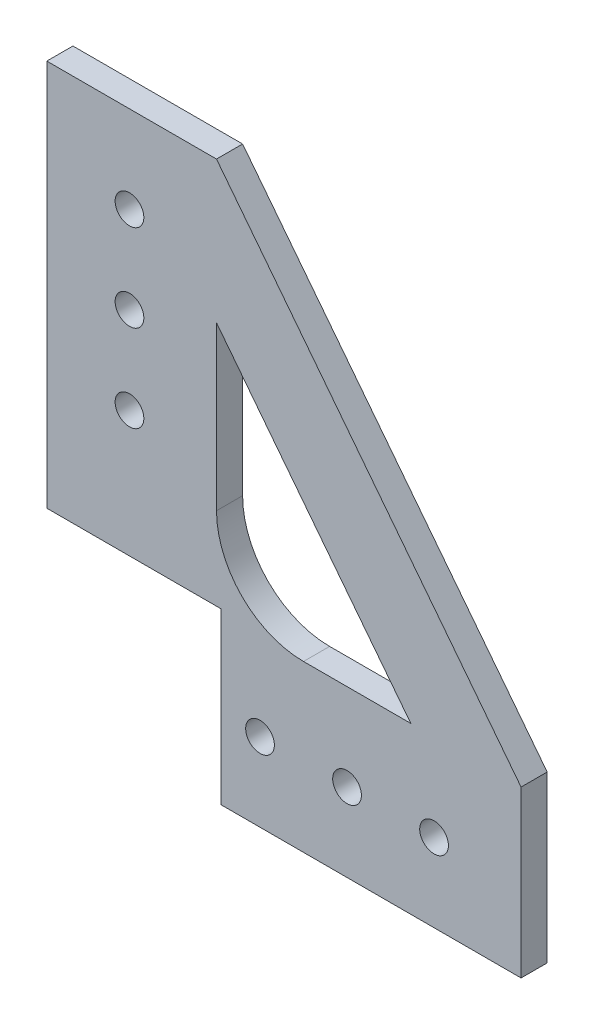
ISO-10303-21;
HEADER;
FILE_DESCRIPTION(('STEP AP214'),'2;1');
FILE_NAME('part.step','',(''),(''),'','','');
FILE_SCHEMA(('AUTOMOTIVE_DESIGN { 1 0 10303 214 1 1 1 1 }'));
ENDSEC;
DATA;
#1=APPLICATION_CONTEXT('core data for automotive mechanical design processes');
#2=APPLICATION_PROTOCOL_DEFINITION('international standard','automotive_design',2000,#1);
#3=PRODUCT_CONTEXT('',#1,'mechanical');
#4=PRODUCT('Part','Part','',(#3));
#5=PRODUCT_RELATED_PRODUCT_CATEGORY('part','',(#4));
#6=PRODUCT_DEFINITION_FORMATION('','',#4);
#7=PRODUCT_DEFINITION_CONTEXT('part definition',#1,'design');
#8=PRODUCT_DEFINITION('design','',#6,#7);
#9=PRODUCT_DEFINITION_SHAPE('','',#8);
#10=(LENGTH_UNIT() NAMED_UNIT(*) SI_UNIT(.MILLI.,.METRE.));
#11=(NAMED_UNIT(*) PLANE_ANGLE_UNIT() SI_UNIT($,.RADIAN.));
#12=(NAMED_UNIT(*) SI_UNIT($,.STERADIAN.) SOLID_ANGLE_UNIT());
#13=UNCERTAINTY_MEASURE_WITH_UNIT(LENGTH_MEASURE(1.E-05),#10,'distance_accuracy_value','');
#14=(GEOMETRIC_REPRESENTATION_CONTEXT(3) GLOBAL_UNCERTAINTY_ASSIGNED_CONTEXT((#13)) GLOBAL_UNIT_ASSIGNED_CONTEXT((#10,
#11,#12)) REPRESENTATION_CONTEXT('',''));
#15=CARTESIAN_POINT('',(0.,0.,0.));
#16=DIRECTION('',(0.,0.,1.));
#17=DIRECTION('',(1.,0.,0.));
#18=AXIS2_PLACEMENT_3D('',#15,#16,#17);
#19=CARTESIAN_POINT('',(0.,0.,3.));
#20=DIRECTION('',(0.,0.,-1.));
#21=DIRECTION('',(-1.,0.,0.));
#22=AXIS2_PLACEMENT_3D('',#19,#20,#21);
#23=PLANE('',#22);
#24=CARTESIAN_POINT('',(45.,-10.,3.));
#25=DIRECTION('',(0.,0.,1.));
#26=DIRECTION('',(1.,0.,0.));
#27=AXIS2_PLACEMENT_3D('',#24,#25,#26);
#28=CIRCLE('',#27,1.65);
#29=CARTESIAN_POINT('',(46.65,-10.,3.));
#30=VERTEX_POINT('',#29);
#31=EDGE_CURVE('E188',#30,#30,#28,.T.);
#32=ORIENTED_EDGE('',*,*,#31,.F.);
#33=EDGE_LOOP('',(#32));
#34=FACE_BOUND('',#33,.T.);
#35=CARTESIAN_POINT('',(35.,-10.,3.));
#36=DIRECTION('',(0.,0.,1.));
#37=DIRECTION('',(1.,0.,0.));
#38=AXIS2_PLACEMENT_3D('',#35,#36,#37);
#39=CIRCLE('',#38,1.65);
#40=CARTESIAN_POINT('',(36.65,-10.,3.));
#41=VERTEX_POINT('',#40);
#42=EDGE_CURVE('E194',#41,#41,#39,.T.);
#43=ORIENTED_EDGE('',*,*,#42,.F.);
#44=EDGE_LOOP('',(#43));
#45=FACE_BOUND('',#44,.T.);
#46=CARTESIAN_POINT('',(25.,-10.,3.));
#47=DIRECTION('',(0.,0.,1.));
#48=DIRECTION('',(1.,0.,0.));
#49=AXIS2_PLACEMENT_3D('',#46,#47,#48);
#50=CIRCLE('',#49,1.65);
#51=CARTESIAN_POINT('',(26.65,-10.,3.));
#52=VERTEX_POINT('',#51);
#53=EDGE_CURVE('E200',#52,#52,#50,.T.);
#54=ORIENTED_EDGE('',*,*,#53,.F.);
#55=EDGE_LOOP('',(#54));
#56=FACE_BOUND('',#55,.T.);
#57=CARTESIAN_POINT('',(10.,35.,3.));
#58=DIRECTION('',(0.,0.,1.));
#59=DIRECTION('',(1.,0.,0.));
#60=AXIS2_PLACEMENT_3D('',#57,#58,#59);
#61=CIRCLE('',#60,1.65000000000001);
#62=CARTESIAN_POINT('',(11.65,35.,3.));
#63=VERTEX_POINT('',#62);
#64=EDGE_CURVE('E206',#63,#63,#61,.T.);
#65=ORIENTED_EDGE('',*,*,#64,.F.);
#66=EDGE_LOOP('',(#65));
#67=FACE_BOUND('',#66,.T.);
#68=CARTESIAN_POINT('',(10.,25.,3.));
#69=DIRECTION('',(0.,0.,1.));
#70=DIRECTION('',(1.,0.,0.));
#71=AXIS2_PLACEMENT_3D('',#68,#69,#70);
#72=CIRCLE('',#71,1.65);
#73=CARTESIAN_POINT('',(11.65,25.,3.));
#74=VERTEX_POINT('',#73);
#75=EDGE_CURVE('E212',#74,#74,#72,.T.);
#76=ORIENTED_EDGE('',*,*,#75,.F.);
#77=EDGE_LOOP('',(#76));
#78=FACE_BOUND('',#77,.T.);
#79=CARTESIAN_POINT('',(10.,15.,3.));
#80=DIRECTION('',(0.,0.,1.));
#81=DIRECTION('',(1.,0.,0.));
#82=AXIS2_PLACEMENT_3D('',#79,#80,#81);
#83=CIRCLE('',#82,1.65);
#84=CARTESIAN_POINT('',(11.65,15.,3.));
#85=VERTEX_POINT('',#84);
#86=EDGE_CURVE('E218',#85,#85,#83,.T.);
#87=ORIENTED_EDGE('',*,*,#86,.F.);
#88=EDGE_LOOP('',(#87));
#89=FACE_BOUND('',#88,.T.);
#90=DIRECTION('',(-1.,0.,0.));
#91=VECTOR('',#90,1.);
#92=CARTESIAN_POINT('',(0.,45.,3.));
#93=LINE('',#92,#91);
#94=CARTESIAN_POINT('',(20.,45.,3.));
#95=VERTEX_POINT('',#94);
#96=CARTESIAN_POINT('',(0.5,45.,3.));
#97=VERTEX_POINT('',#96);
#98=EDGE_CURVE('E229',#95,#97,#93,.T.);
#99=ORIENTED_EDGE('',*,*,#98,.T.);
#100=DIRECTION('',(0.,1.,0.));
#101=VECTOR('',#100,1.);
#102=CARTESIAN_POINT('',(0.5,0.5,3.));
#103=LINE('',#102,#101);
#104=CARTESIAN_POINT('',(0.5,0.5,3.));
#105=VERTEX_POINT('',#104);
#106=EDGE_CURVE('E56',#105,#97,#103,.T.);
#107=ORIENTED_EDGE('',*,*,#106,.F.);
#108=DIRECTION('',(-1.,0.,0.));
#109=VECTOR('',#108,1.);
#110=CARTESIAN_POINT('',(0.5,0.5,3.));
#111=LINE('',#110,#109);
#112=CARTESIAN_POINT('',(20.5,0.5,3.));
#113=VERTEX_POINT('',#112);
#114=EDGE_CURVE('E134',#113,#105,#111,.T.);
#115=ORIENTED_EDGE('',*,*,#114,.F.);
#116=DIRECTION('',(0.,1.,0.));
#117=VECTOR('',#116,1.);
#118=CARTESIAN_POINT('',(20.5,0.5,3.));
#119=LINE('',#118,#117);
#120=CARTESIAN_POINT('',(20.5,-19.,3.));
#121=VERTEX_POINT('',#120);
#122=EDGE_CURVE('E128',#121,#113,#119,.T.);
#123=ORIENTED_EDGE('',*,*,#122,.F.);
#124=DIRECTION('',(-1.,0.,0.));
#125=VECTOR('',#124,1.);
#126=CARTESIAN_POINT('',(20.5,-19.,3.));
#127=LINE('',#126,#125);
#128=CARTESIAN_POINT('',(55.,-19.,3.));
#129=VERTEX_POINT('',#128);
#130=EDGE_CURVE('E137',#129,#121,#127,.T.);
#131=ORIENTED_EDGE('',*,*,#130,.F.);
#132=DIRECTION('',(0.,1.,0.));
#133=VECTOR('',#132,1.);
#134=CARTESIAN_POINT('',(55.,0.,3.));
#135=LINE('',#134,#133);
#136=CARTESIAN_POINT('',(55.,0.,3.));
#137=VERTEX_POINT('',#136);
#138=EDGE_CURVE('E224',#129,#137,#135,.T.);
#139=ORIENTED_EDGE('',*,*,#138,.T.);
#140=DIRECTION('',(-0.61394061351492,0.789352217376326,0.));
#141=VECTOR('',#140,1.);
#142=CARTESIAN_POINT('',(20.,45.,3.));
#143=LINE('',#142,#141);
#144=EDGE_CURVE('E226',#137,#95,#143,.T.);
#145=ORIENTED_EDGE('',*,*,#144,.T.);
#146=EDGE_LOOP('',(#99,#107,#115,#123,#131,#139,#145));
#147=FACE_BOUND('',#146,.T.);
#148=DIRECTION('',(-0.61394061351492,0.789352217376326,0.));
#149=VECTOR('',#148,1.);
#150=CARTESIAN_POINT('',(20.,28.7117796414409,3.));
#151=LINE('',#150,#149);
#152=CARTESIAN_POINT('',(42.3313841655651,0.,3.));
#153=VERTEX_POINT('',#152);
#154=CARTESIAN_POINT('',(20.,28.7117796414409,3.));
#155=VERTEX_POINT('',#154);
#156=EDGE_CURVE('E159',#153,#155,#151,.T.);
#157=ORIENTED_EDGE('',*,*,#156,.F.);
#158=DIRECTION('',(1.,0.,0.));
#159=VECTOR('',#158,1.);
#160=CARTESIAN_POINT('',(30.0000000000001,0.,3.));
#161=LINE('',#160,#159);
#162=CARTESIAN_POINT('',(30.0000000000001,0.,3.));
#163=VERTEX_POINT('',#162);
#164=EDGE_CURVE('E166',#163,#153,#161,.T.);
#165=ORIENTED_EDGE('',*,*,#164,.F.);
#166=CARTESIAN_POINT('',(30.,10.,3.));
#167=DIRECTION('',(0.,0.,1.));
#168=DIRECTION('',(-1.,0.,0.));
#169=AXIS2_PLACEMENT_3D('',#166,#167,#168);
#170=CIRCLE('',#169,10.);
#171=CARTESIAN_POINT('',(20.,10.0000000000001,3.));
#172=VERTEX_POINT('',#171);
#173=EDGE_CURVE('E164',#172,#163,#170,.T.);
#174=ORIENTED_EDGE('',*,*,#173,.F.);
#175=DIRECTION('',(0.,-1.,0.));
#176=VECTOR('',#175,1.);
#177=CARTESIAN_POINT('',(20.,10.0000000000001,3.));
#178=LINE('',#177,#176);
#179=EDGE_CURVE('E161',#155,#172,#178,.T.);
#180=ORIENTED_EDGE('',*,*,#179,.F.);
#181=EDGE_LOOP('',(#157,#165,#174,#180));
#182=FACE_BOUND('',#181,.T.);
#183=ADVANCED_FACE('F41',(#34,#45,#56,#67,#78,#89,#147,#182),#23,.F.);
#184=CARTESIAN_POINT('',(0.,0.,0.));
#185=DIRECTION('',(0.,0.,-1.));
#186=DIRECTION('',(-1.,0.,0.));
#187=AXIS2_PLACEMENT_3D('',#184,#185,#186);
#188=PLANE('',#187);
#189=DIRECTION('',(0.,-1.,0.));
#190=VECTOR('',#189,1.);
#191=CARTESIAN_POINT('',(0.5,0.,0.));
#192=LINE('',#191,#190);
#193=CARTESIAN_POINT('',(0.5,45.,0.));
#194=VERTEX_POINT('',#193);
#195=CARTESIAN_POINT('',(0.5,0.5,0.));
#196=VERTEX_POINT('',#195);
#197=EDGE_CURVE('E153',#194,#196,#192,.T.);
#198=ORIENTED_EDGE('',*,*,#197,.F.);
#199=DIRECTION('',(-1.,0.,0.));
#200=VECTOR('',#199,1.);
#201=CARTESIAN_POINT('',(0.,45.,0.));
#202=LINE('',#201,#200);
#203=CARTESIAN_POINT('',(20.,45.,0.));
#204=VERTEX_POINT('',#203);
#205=EDGE_CURVE('E227',#204,#194,#202,.T.);
#206=ORIENTED_EDGE('',*,*,#205,.F.);
#207=DIRECTION('',(-0.61394061351492,0.789352217376326,0.));
#208=VECTOR('',#207,1.);
#209=CARTESIAN_POINT('',(20.,45.,0.));
#210=LINE('',#209,#208);
#211=CARTESIAN_POINT('',(55.,0.,0.));
#212=VERTEX_POINT('',#211);
#213=EDGE_CURVE('E233',#212,#204,#210,.T.);
#214=ORIENTED_EDGE('',*,*,#213,.F.);
#215=DIRECTION('',(0.,1.,0.));
#216=VECTOR('',#215,1.);
#217=CARTESIAN_POINT('',(55.,0.,0.));
#218=LINE('',#217,#216);
#219=CARTESIAN_POINT('',(55.,-19.,0.));
#220=VERTEX_POINT('',#219);
#221=EDGE_CURVE('E221',#220,#212,#218,.T.);
#222=ORIENTED_EDGE('',*,*,#221,.F.);
#223=DIRECTION('',(1.,0.,0.));
#224=VECTOR('',#223,1.);
#225=CARTESIAN_POINT('',(0.,-19.,0.));
#226=LINE('',#225,#224);
#227=CARTESIAN_POINT('',(20.5,-19.,0.));
#228=VERTEX_POINT('',#227);
#229=EDGE_CURVE('E156',#228,#220,#226,.T.);
#230=ORIENTED_EDGE('',*,*,#229,.F.);
#231=DIRECTION('',(0.,-1.,0.));
#232=VECTOR('',#231,1.);
#233=CARTESIAN_POINT('',(20.5,0.,0.));
#234=LINE('',#233,#232);
#235=CARTESIAN_POINT('',(20.5,0.5,0.));
#236=VERTEX_POINT('',#235);
#237=EDGE_CURVE('E49',#236,#228,#234,.T.);
#238=ORIENTED_EDGE('',*,*,#237,.F.);
#239=DIRECTION('',(1.,0.,0.));
#240=VECTOR('',#239,1.);
#241=CARTESIAN_POINT('',(0.,0.5,0.));
#242=LINE('',#241,#240);
#243=EDGE_CURVE('E11',#196,#236,#242,.T.);
#244=ORIENTED_EDGE('',*,*,#243,.F.);
#245=EDGE_LOOP('',(#198,#206,#214,#222,#230,#238,#244));
#246=FACE_BOUND('',#245,.T.);
#247=CARTESIAN_POINT('',(35.,-10.,0.));
#248=DIRECTION('',(0.,0.,1.));
#249=DIRECTION('',(1.,0.,0.));
#250=AXIS2_PLACEMENT_3D('',#247,#248,#249);
#251=CIRCLE('',#250,1.65);
#252=CARTESIAN_POINT('',(36.65,-10.,0.));
#253=VERTEX_POINT('',#252);
#254=EDGE_CURVE('E191',#253,#253,#251,.T.);
#255=ORIENTED_EDGE('',*,*,#254,.T.);
#256=EDGE_LOOP('',(#255));
#257=FACE_BOUND('',#256,.T.);
#258=CARTESIAN_POINT('',(10.,35.,0.));
#259=DIRECTION('',(0.,0.,1.));
#260=DIRECTION('',(1.,0.,0.));
#261=AXIS2_PLACEMENT_3D('',#258,#259,#260);
#262=CIRCLE('',#261,1.65000000000001);
#263=CARTESIAN_POINT('',(11.65,35.,0.));
#264=VERTEX_POINT('',#263);
#265=EDGE_CURVE('E203',#264,#264,#262,.T.);
#266=ORIENTED_EDGE('',*,*,#265,.T.);
#267=EDGE_LOOP('',(#266));
#268=FACE_BOUND('',#267,.T.);
#269=CARTESIAN_POINT('',(10.,15.,0.));
#270=DIRECTION('',(0.,0.,1.));
#271=DIRECTION('',(1.,0.,0.));
#272=AXIS2_PLACEMENT_3D('',#269,#270,#271);
#273=CIRCLE('',#272,1.65);
#274=CARTESIAN_POINT('',(11.65,15.,0.));
#275=VERTEX_POINT('',#274);
#276=EDGE_CURVE('E215',#275,#275,#273,.T.);
#277=ORIENTED_EDGE('',*,*,#276,.T.);
#278=EDGE_LOOP('',(#277));
#279=FACE_BOUND('',#278,.T.);
#280=CARTESIAN_POINT('',(10.,25.,0.));
#281=DIRECTION('',(0.,0.,1.));
#282=DIRECTION('',(1.,0.,0.));
#283=AXIS2_PLACEMENT_3D('',#280,#281,#282);
#284=CIRCLE('',#283,1.65);
#285=CARTESIAN_POINT('',(11.65,25.,0.));
#286=VERTEX_POINT('',#285);
#287=EDGE_CURVE('E209',#286,#286,#284,.T.);
#288=ORIENTED_EDGE('',*,*,#287,.T.);
#289=EDGE_LOOP('',(#288));
#290=FACE_BOUND('',#289,.T.);
#291=CARTESIAN_POINT('',(25.,-10.,0.));
#292=DIRECTION('',(0.,0.,1.));
#293=DIRECTION('',(1.,0.,0.));
#294=AXIS2_PLACEMENT_3D('',#291,#292,#293);
#295=CIRCLE('',#294,1.65);
#296=CARTESIAN_POINT('',(26.65,-10.,0.));
#297=VERTEX_POINT('',#296);
#298=EDGE_CURVE('E197',#297,#297,#295,.T.);
#299=ORIENTED_EDGE('',*,*,#298,.T.);
#300=EDGE_LOOP('',(#299));
#301=FACE_BOUND('',#300,.T.);
#302=CARTESIAN_POINT('',(45.,-10.,0.));
#303=DIRECTION('',(0.,0.,1.));
#304=DIRECTION('',(1.,0.,0.));
#305=AXIS2_PLACEMENT_3D('',#302,#303,#304);
#306=CIRCLE('',#305,1.65);
#307=CARTESIAN_POINT('',(46.65,-10.,0.));
#308=VERTEX_POINT('',#307);
#309=EDGE_CURVE('E187',#308,#308,#306,.T.);
#310=ORIENTED_EDGE('',*,*,#309,.T.);
#311=EDGE_LOOP('',(#310));
#312=FACE_BOUND('',#311,.T.);
#313=DIRECTION('',(1.,0.,0.));
#314=VECTOR('',#313,1.);
#315=CARTESIAN_POINT('',(30.0000000000001,0.,0.));
#316=LINE('',#315,#314);
#317=CARTESIAN_POINT('',(30.0000000000001,0.,0.));
#318=VERTEX_POINT('',#317);
#319=CARTESIAN_POINT('',(42.3313841655651,0.,0.));
#320=VERTEX_POINT('',#319);
#321=EDGE_CURVE('E162',#318,#320,#316,.T.);
#322=ORIENTED_EDGE('',*,*,#321,.T.);
#323=DIRECTION('',(-0.61394061351492,0.789352217376326,0.));
#324=VECTOR('',#323,1.);
#325=CARTESIAN_POINT('',(20.,28.7117796414409,0.));
#326=LINE('',#325,#324);
#327=CARTESIAN_POINT('',(20.,28.7117796414409,0.));
#328=VERTEX_POINT('',#327);
#329=EDGE_CURVE('E158',#320,#328,#326,.T.);
#330=ORIENTED_EDGE('',*,*,#329,.T.);
#331=DIRECTION('',(0.,-1.,0.));
#332=VECTOR('',#331,1.);
#333=CARTESIAN_POINT('',(20.,10.0000000000001,0.));
#334=LINE('',#333,#332);
#335=CARTESIAN_POINT('',(20.,10.0000000000001,0.));
#336=VERTEX_POINT('',#335);
#337=EDGE_CURVE('E171',#328,#336,#334,.T.);
#338=ORIENTED_EDGE('',*,*,#337,.T.);
#339=CARTESIAN_POINT('',(30.,10.,0.));
#340=DIRECTION('',(0.,0.,1.));
#341=DIRECTION('',(-1.,0.,0.));
#342=AXIS2_PLACEMENT_3D('',#339,#340,#341);
#343=CIRCLE('',#342,10.);
#344=EDGE_CURVE('E174',#336,#318,#343,.T.);
#345=ORIENTED_EDGE('',*,*,#344,.T.);
#346=EDGE_LOOP('',(#322,#330,#338,#345));
#347=FACE_BOUND('',#346,.T.);
#348=ADVANCED_FACE('F250',(#246,#257,#268,#279,#290,#301,#312,#347),#188,.T.);
#349=CARTESIAN_POINT('',(55.,0.,3.));
#350=DIRECTION('',(-1.,0.,0.));
#351=DIRECTION('',(0.,0.,1.));
#352=AXIS2_PLACEMENT_3D('',#349,#350,#351);
#353=PLANE('',#352);
#354=ORIENTED_EDGE('',*,*,#138,.F.);
#355=DIRECTION('',(0.,0.,-1.));
#356=VECTOR('',#355,1.);
#357=CARTESIAN_POINT('',(55.,-19.,3.));
#358=LINE('',#357,#356);
#359=EDGE_CURVE('E140',#129,#220,#358,.T.);
#360=ORIENTED_EDGE('',*,*,#359,.T.);
#361=ORIENTED_EDGE('',*,*,#221,.T.);
#362=DIRECTION('',(0.,0.,-1.));
#363=VECTOR('',#362,1.);
#364=CARTESIAN_POINT('',(55.,0.,3.));
#365=LINE('',#364,#363);
#366=EDGE_CURVE('E239',#137,#212,#365,.T.);
#367=ORIENTED_EDGE('',*,*,#366,.F.);
#368=EDGE_LOOP('',(#354,#360,#361,#367));
#369=FACE_BOUND('',#368,.T.);
#370=ADVANCED_FACE('F43',(#369),#353,.F.);
#371=CARTESIAN_POINT('',(20.,45.,3.));
#372=DIRECTION('',(-0.789352217376326,-0.613940613514921,0.));
#373=DIRECTION('',(0.613940613514921,-0.789352217376326,0.));
#374=AXIS2_PLACEMENT_3D('',#371,#372,#373);
#375=PLANE('',#374);
#376=ORIENTED_EDGE('',*,*,#213,.T.);
#377=DIRECTION('',(0.,0.,-1.));
#378=VECTOR('',#377,1.);
#379=CARTESIAN_POINT('',(20.,45.,3.));
#380=LINE('',#379,#378);
#381=EDGE_CURVE('E231',#95,#204,#380,.T.);
#382=ORIENTED_EDGE('',*,*,#381,.F.);
#383=ORIENTED_EDGE('',*,*,#144,.F.);
#384=ORIENTED_EDGE('',*,*,#366,.T.);
#385=EDGE_LOOP('',(#376,#382,#383,#384));
#386=FACE_BOUND('',#385,.T.);
#387=ADVANCED_FACE('F255',(#386),#375,.F.);
#388=CARTESIAN_POINT('',(0.,45.,3.));
#389=DIRECTION('',(0.,-1.,0.));
#390=DIRECTION('',(0.,0.,-1.));
#391=AXIS2_PLACEMENT_3D('',#388,#389,#390);
#392=PLANE('',#391);
#393=ORIENTED_EDGE('',*,*,#205,.T.);
#394=DIRECTION('',(0.,0.,1.));
#395=VECTOR('',#394,1.);
#396=CARTESIAN_POINT('',(0.5,45.,3.));
#397=LINE('',#396,#395);
#398=EDGE_CURVE('E242',#194,#97,#397,.T.);
#399=ORIENTED_EDGE('',*,*,#398,.T.);
#400=ORIENTED_EDGE('',*,*,#98,.F.);
#401=ORIENTED_EDGE('',*,*,#381,.T.);
#402=EDGE_LOOP('',(#393,#399,#400,#401));
#403=FACE_BOUND('',#402,.T.);
#404=ADVANCED_FACE('F259',(#403),#392,.F.);
#405=CARTESIAN_POINT('',(10.,15.,3.));
#406=DIRECTION('',(0.,0.,-1.));
#407=DIRECTION('',(-1.,0.,0.));
#408=AXIS2_PLACEMENT_3D('',#405,#406,#407);
#409=CYLINDRICAL_SURFACE('',#408,1.65);
#410=ORIENTED_EDGE('',*,*,#86,.T.);
#411=EDGE_LOOP('',(#410));
#412=FACE_BOUND('',#411,.T.);
#413=ORIENTED_EDGE('',*,*,#276,.F.);
#414=EDGE_LOOP('',(#413));
#415=FACE_BOUND('',#414,.T.);
#416=ADVANCED_FACE('F285',(#412,#415),#409,.F.);
#417=CARTESIAN_POINT('',(10.,25.,3.));
#418=DIRECTION('',(0.,0.,-1.));
#419=DIRECTION('',(-1.,0.,0.));
#420=AXIS2_PLACEMENT_3D('',#417,#418,#419);
#421=CYLINDRICAL_SURFACE('',#420,1.65);
#422=ORIENTED_EDGE('',*,*,#75,.T.);
#423=EDGE_LOOP('',(#422));
#424=FACE_BOUND('',#423,.T.);
#425=ORIENTED_EDGE('',*,*,#287,.F.);
#426=EDGE_LOOP('',(#425));
#427=FACE_BOUND('',#426,.T.);
#428=ADVANCED_FACE('F364',(#424,#427),#421,.F.);
#429=CARTESIAN_POINT('',(10.,35.,3.));
#430=DIRECTION('',(0.,0.,-1.));
#431=DIRECTION('',(-1.,0.,0.));
#432=AXIS2_PLACEMENT_3D('',#429,#430,#431);
#433=CYLINDRICAL_SURFACE('',#432,1.65000000000001);
#434=ORIENTED_EDGE('',*,*,#64,.T.);
#435=EDGE_LOOP('',(#434));
#436=FACE_BOUND('',#435,.T.);
#437=ORIENTED_EDGE('',*,*,#265,.F.);
#438=EDGE_LOOP('',(#437));
#439=FACE_BOUND('',#438,.T.);
#440=ADVANCED_FACE('F361',(#436,#439),#433,.F.);
#441=CARTESIAN_POINT('',(25.,-10.,3.));
#442=DIRECTION('',(0.,0.,-1.));
#443=DIRECTION('',(-1.,0.,0.));
#444=AXIS2_PLACEMENT_3D('',#441,#442,#443);
#445=CYLINDRICAL_SURFACE('',#444,1.65);
#446=ORIENTED_EDGE('',*,*,#53,.T.);
#447=EDGE_LOOP('',(#446));
#448=FACE_BOUND('',#447,.T.);
#449=ORIENTED_EDGE('',*,*,#298,.F.);
#450=EDGE_LOOP('',(#449));
#451=FACE_BOUND('',#450,.T.);
#452=ADVANCED_FACE('F357',(#448,#451),#445,.F.);
#453=CARTESIAN_POINT('',(35.,-10.,3.));
#454=DIRECTION('',(0.,0.,-1.));
#455=DIRECTION('',(-1.,0.,0.));
#456=AXIS2_PLACEMENT_3D('',#453,#454,#455);
#457=CYLINDRICAL_SURFACE('',#456,1.65);
#458=ORIENTED_EDGE('',*,*,#42,.T.);
#459=EDGE_LOOP('',(#458));
#460=FACE_BOUND('',#459,.T.);
#461=ORIENTED_EDGE('',*,*,#254,.F.);
#462=EDGE_LOOP('',(#461));
#463=FACE_BOUND('',#462,.T.);
#464=ADVANCED_FACE('F353',(#460,#463),#457,.F.);
#465=CARTESIAN_POINT('',(45.,-10.,3.));
#466=DIRECTION('',(0.,0.,-1.));
#467=DIRECTION('',(-1.,0.,0.));
#468=AXIS2_PLACEMENT_3D('',#465,#466,#467);
#469=CYLINDRICAL_SURFACE('',#468,1.65);
#470=ORIENTED_EDGE('',*,*,#31,.T.);
#471=EDGE_LOOP('',(#470));
#472=FACE_BOUND('',#471,.T.);
#473=ORIENTED_EDGE('',*,*,#309,.F.);
#474=EDGE_LOOP('',(#473));
#475=FACE_BOUND('',#474,.T.);
#476=ADVANCED_FACE('F349',(#472,#475),#469,.F.);
#477=CARTESIAN_POINT('',(20.,28.7117796414409,3.));
#478=DIRECTION('',(-0.789352217376326,-0.613940613514921,0.));
#479=DIRECTION('',(0.613940613514921,-0.789352217376326,0.));
#480=AXIS2_PLACEMENT_3D('',#477,#478,#479);
#481=PLANE('',#480);
#482=ORIENTED_EDGE('',*,*,#329,.F.);
#483=DIRECTION('',(0.,0.,-1.));
#484=VECTOR('',#483,1.);
#485=CARTESIAN_POINT('',(42.3313841655651,0.,3.));
#486=LINE('',#485,#484);
#487=EDGE_CURVE('E168',#153,#320,#486,.T.);
#488=ORIENTED_EDGE('',*,*,#487,.F.);
#489=ORIENTED_EDGE('',*,*,#156,.T.);
#490=DIRECTION('',(0.,0.,-1.));
#491=VECTOR('',#490,1.);
#492=CARTESIAN_POINT('',(20.,28.7117796414409,3.));
#493=LINE('',#492,#491);
#494=EDGE_CURVE('E184',#155,#328,#493,.T.);
#495=ORIENTED_EDGE('',*,*,#494,.T.);
#496=EDGE_LOOP('',(#482,#488,#489,#495));
#497=FACE_BOUND('',#496,.T.);
#498=ADVANCED_FACE('F345',(#497),#481,.T.);
#499=CARTESIAN_POINT('',(20.,10.0000000000001,3.));
#500=DIRECTION('',(1.,0.,0.));
#501=DIRECTION('',(0.,0.,-1.));
#502=AXIS2_PLACEMENT_3D('',#499,#500,#501);
#503=PLANE('',#502);
#504=ORIENTED_EDGE('',*,*,#337,.F.);
#505=ORIENTED_EDGE('',*,*,#494,.F.);
#506=ORIENTED_EDGE('',*,*,#179,.T.);
#507=DIRECTION('',(0.,0.,-1.));
#508=VECTOR('',#507,1.);
#509=CARTESIAN_POINT('',(20.,10.0000000000001,3.));
#510=LINE('',#509,#508);
#511=EDGE_CURVE('E182',#172,#336,#510,.T.);
#512=ORIENTED_EDGE('',*,*,#511,.T.);
#513=EDGE_LOOP('',(#504,#505,#506,#512));
#514=FACE_BOUND('',#513,.T.);
#515=ADVANCED_FACE('F341',(#514),#503,.T.);
#516=CARTESIAN_POINT('',(30.,10.,3.));
#517=DIRECTION('',(0.,0.,-1.));
#518=DIRECTION('',(-1.,0.,0.));
#519=AXIS2_PLACEMENT_3D('',#516,#517,#518);
#520=CYLINDRICAL_SURFACE('',#519,10.);
#521=ORIENTED_EDGE('',*,*,#344,.F.);
#522=ORIENTED_EDGE('',*,*,#511,.F.);
#523=ORIENTED_EDGE('',*,*,#173,.T.);
#524=DIRECTION('',(0.,0.,-1.));
#525=VECTOR('',#524,1.);
#526=CARTESIAN_POINT('',(30.0000000000001,0.,3.));
#527=LINE('',#526,#525);
#528=EDGE_CURVE('E64',#163,#318,#527,.T.);
#529=ORIENTED_EDGE('',*,*,#528,.T.);
#530=EDGE_LOOP('',(#521,#522,#523,#529));
#531=FACE_BOUND('',#530,.T.);
#532=ADVANCED_FACE('F338',(#531),#520,.F.);
#533=CARTESIAN_POINT('',(30.0000000000001,0.,3.));
#534=DIRECTION('',(0.,1.,0.));
#535=DIRECTION('',(-1.,0.,0.));
#536=AXIS2_PLACEMENT_3D('',#533,#534,#535);
#537=PLANE('',#536);
#538=ORIENTED_EDGE('',*,*,#321,.F.);
#539=ORIENTED_EDGE('',*,*,#528,.F.);
#540=ORIENTED_EDGE('',*,*,#164,.T.);
#541=ORIENTED_EDGE('',*,*,#487,.T.);
#542=EDGE_LOOP('',(#538,#539,#540,#541));
#543=FACE_BOUND('',#542,.T.);
#544=ADVANCED_FACE('F272',(#543),#537,.T.);
#545=CARTESIAN_POINT('',(0.5,0.5,-7.));
#546=DIRECTION('',(1.,0.,0.));
#547=DIRECTION('',(0.,0.,-1.));
#548=AXIS2_PLACEMENT_3D('',#545,#546,#547);
#549=PLANE('',#548);
#550=ORIENTED_EDGE('',*,*,#197,.T.);
#551=DIRECTION('',(0.,0.,1.));
#552=VECTOR('',#551,1.);
#553=CARTESIAN_POINT('',(0.5,0.5,-7.));
#554=LINE('',#553,#552);
#555=EDGE_CURVE('E151',#196,#105,#554,.T.);
#556=ORIENTED_EDGE('',*,*,#555,.T.);
#557=ORIENTED_EDGE('',*,*,#106,.T.);
#558=ORIENTED_EDGE('',*,*,#398,.F.);
#559=EDGE_LOOP('',(#550,#556,#557,#558));
#560=FACE_BOUND('',#559,.T.);
#561=ADVANCED_FACE('F260',(#560),#549,.F.);
#562=CARTESIAN_POINT('',(0.5,0.5,-7.));
#563=DIRECTION('',(0.,1.,0.));
#564=DIRECTION('',(0.,0.,1.));
#565=AXIS2_PLACEMENT_3D('',#562,#563,#564);
#566=PLANE('',#565);
#567=ORIENTED_EDGE('',*,*,#243,.T.);
#568=DIRECTION('',(0.,0.,1.));
#569=VECTOR('',#568,1.);
#570=CARTESIAN_POINT('',(20.5,0.5,-7.));
#571=LINE('',#570,#569);
#572=EDGE_CURVE('E133',#236,#113,#571,.T.);
#573=ORIENTED_EDGE('',*,*,#572,.T.);
#574=ORIENTED_EDGE('',*,*,#114,.T.);
#575=ORIENTED_EDGE('',*,*,#555,.F.);
#576=EDGE_LOOP('',(#567,#573,#574,#575));
#577=FACE_BOUND('',#576,.T.);
#578=ADVANCED_FACE('F264',(#577),#566,.F.);
#579=CARTESIAN_POINT('',(20.5,0.5,-7.));
#580=DIRECTION('',(1.,0.,0.));
#581=DIRECTION('',(0.,1.,0.));
#582=AXIS2_PLACEMENT_3D('',#579,#580,#581);
#583=PLANE('',#582);
#584=ORIENTED_EDGE('',*,*,#237,.T.);
#585=DIRECTION('',(0.,0.,1.));
#586=VECTOR('',#585,1.);
#587=CARTESIAN_POINT('',(20.5,-19.,-7.));
#588=LINE('',#587,#586);
#589=EDGE_CURVE('E123',#228,#121,#588,.T.);
#590=ORIENTED_EDGE('',*,*,#589,.T.);
#591=ORIENTED_EDGE('',*,*,#122,.T.);
#592=ORIENTED_EDGE('',*,*,#572,.F.);
#593=EDGE_LOOP('',(#584,#590,#591,#592));
#594=FACE_BOUND('',#593,.T.);
#595=ADVANCED_FACE('F125',(#594),#583,.F.);
#596=CARTESIAN_POINT('',(20.5,-19.,-7.));
#597=DIRECTION('',(0.,1.,0.));
#598=DIRECTION('',(-1.,0.,0.));
#599=AXIS2_PLACEMENT_3D('',#596,#597,#598);
#600=PLANE('',#599);
#601=ORIENTED_EDGE('',*,*,#229,.T.);
#602=ORIENTED_EDGE('',*,*,#359,.F.);
#603=ORIENTED_EDGE('',*,*,#130,.T.);
#604=ORIENTED_EDGE('',*,*,#589,.F.);
#605=EDGE_LOOP('',(#601,#602,#603,#604));
#606=FACE_BOUND('',#605,.T.);
#607=ADVANCED_FACE('F138',(#606),#600,.F.);
#608=CLOSED_SHELL('',(#183,#348,#370,#387,#404,#416,#428,#440,#452,#464,#476,#498,#515,#532,
#544,#561,#578,#595,#607));
#609=MANIFOLD_SOLID_BREP('B2',#608);
#610=ADVANCED_BREP_SHAPE_REPRESENTATION('',(#18,#609),#14);
#611=SHAPE_DEFINITION_REPRESENTATION(#9,#610);
ENDSEC;
END-ISO-10303-21;
